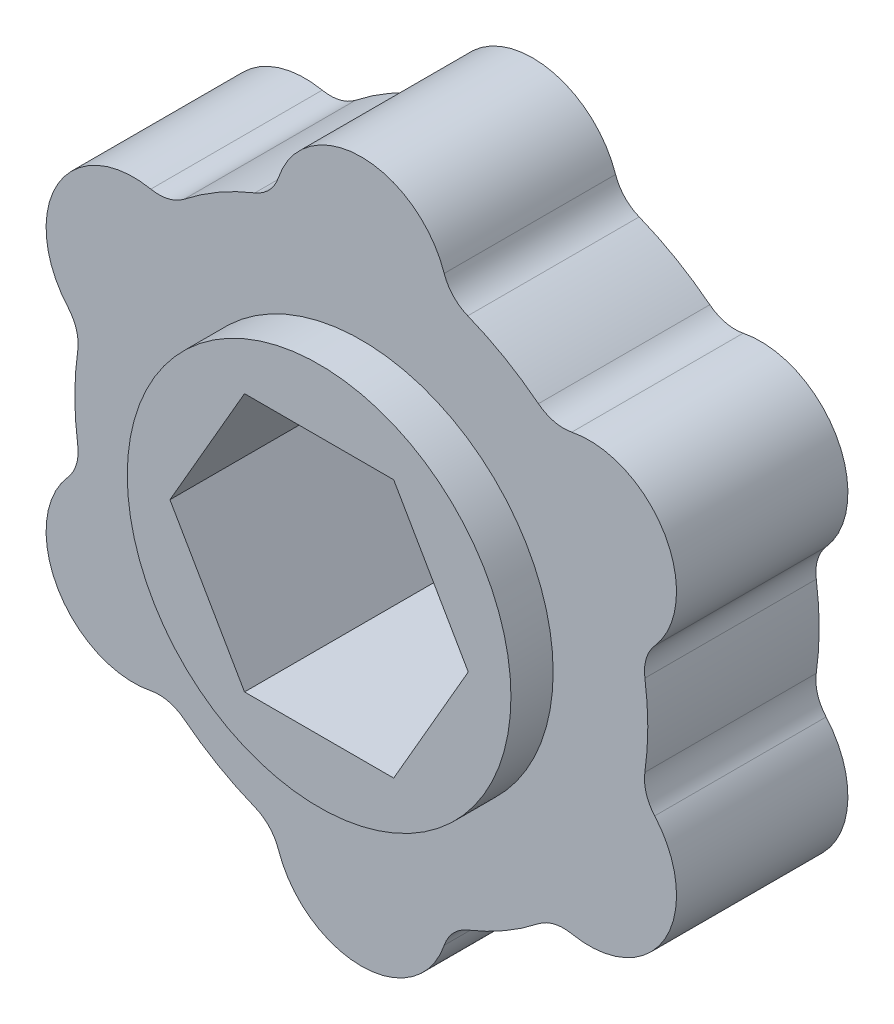
ISO-10303-21;
HEADER;
FILE_DESCRIPTION(('STEP AP214'),'2;1');
FILE_NAME('part.step','',(''),(''),'','','');
FILE_SCHEMA(('AUTOMOTIVE_DESIGN { 1 0 10303 214 1 1 1 1 }'));
ENDSEC;
DATA;
#1=APPLICATION_CONTEXT('core data for automotive mechanical design processes');
#2=APPLICATION_PROTOCOL_DEFINITION('international standard','automotive_design',2000,#1);
#3=PRODUCT_CONTEXT('',#1,'mechanical');
#4=PRODUCT('Part','Part','',(#3));
#5=PRODUCT_RELATED_PRODUCT_CATEGORY('part','',(#4));
#6=PRODUCT_DEFINITION_FORMATION('','',#4);
#7=PRODUCT_DEFINITION_CONTEXT('part definition',#1,'design');
#8=PRODUCT_DEFINITION('design','',#6,#7);
#9=PRODUCT_DEFINITION_SHAPE('','',#8);
#10=(LENGTH_UNIT() NAMED_UNIT(*) SI_UNIT(.MILLI.,.METRE.));
#11=(NAMED_UNIT(*) PLANE_ANGLE_UNIT() SI_UNIT($,.RADIAN.));
#12=(NAMED_UNIT(*) SI_UNIT($,.STERADIAN.) SOLID_ANGLE_UNIT());
#13=UNCERTAINTY_MEASURE_WITH_UNIT(LENGTH_MEASURE(1.E-05),#10,'distance_accuracy_value','');
#14=(GEOMETRIC_REPRESENTATION_CONTEXT(3) GLOBAL_UNCERTAINTY_ASSIGNED_CONTEXT((#13)) GLOBAL_UNIT_ASSIGNED_CONTEXT((#10,
#11,#12)) REPRESENTATION_CONTEXT('',''));
#15=CARTESIAN_POINT('',(0.,0.,0.));
#16=DIRECTION('',(0.,0.,1.));
#17=DIRECTION('',(1.,0.,0.));
#18=AXIS2_PLACEMENT_3D('',#15,#16,#17);
#19=CARTESIAN_POINT('',(0.,0.,8.509));
#20=DIRECTION('',(0.,0.,1.));
#21=DIRECTION('',(1.,0.,0.));
#22=AXIS2_PLACEMENT_3D('',#19,#20,#21);
#23=PLANE('',#22);
#24=CARTESIAN_POINT('',(-11.3064812616481,6.52779999999999,8.509));
#25=DIRECTION('',(0.,0.,1.));
#26=DIRECTION('',(1.,0.,0.));
#27=AXIS2_PLACEMENT_3D('',#24,#25,#26);
#28=CIRCLE('',#27,4.3434);
#29=CARTESIAN_POINT('',(-14.5657181723204,3.65682484857297,8.509));
#30=VERTEX_POINT('',#29);
#31=CARTESIAN_POINT('',(-10.4497623022146,10.7858695373076,8.509));
#32=VERTEX_POINT('',#31);
#33=EDGE_CURVE('E391',#30,#32,#28,.F.);
#34=ORIENTED_EDGE('',*,*,#33,.F.);
#35=CARTESIAN_POINT('',(-16.0905073702957,2.31367857889951,8.509));
#36=DIRECTION('',(0.,0.,1.));
#37=DIRECTION('',(1.,0.,0.));
#38=AXIS2_PLACEMENT_3D('',#35,#36,#37);
#39=CIRCLE('',#38,2.032);
#40=CARTESIAN_POINT('',(-14.0791939490088,2.02446875653707,8.509));
#41=VERTEX_POINT('',#40);
#42=EDGE_CURVE('E110',#30,#41,#39,.F.);
#43=ORIENTED_EDGE('',*,*,#42,.T.);
#44=CARTESIAN_POINT('',(0.,0.,8.509));
#45=DIRECTION('',(0.,0.,1.));
#46=DIRECTION('',(1.,0.,0.));
#47=AXIS2_PLACEMENT_3D('',#44,#45,#46);
#48=CIRCLE('',#47,14.224);
#49=CARTESIAN_POINT('',(-14.0791939490088,-2.02446875653709,8.509));
#50=VERTEX_POINT('',#49);
#51=EDGE_CURVE('E440',#41,#50,#48,.T.);
#52=ORIENTED_EDGE('',*,*,#51,.T.);
#53=CARTESIAN_POINT('',(-16.0905073702957,-2.31367857889953,8.509));
#54=DIRECTION('',(0.,0.,1.));
#55=DIRECTION('',(1.,0.,0.));
#56=AXIS2_PLACEMENT_3D('',#53,#54,#55);
#57=CIRCLE('',#56,2.032);
#58=CARTESIAN_POINT('',(-14.5657181723204,-3.65682484857299,8.509));
#59=VERTEX_POINT('',#58);
#60=EDGE_CURVE('E593',#50,#59,#57,.F.);
#61=ORIENTED_EDGE('',*,*,#60,.T.);
#62=CARTESIAN_POINT('',(-11.3064812616481,-6.52780000000001,8.509));
#63=DIRECTION('',(0.,0.,1.));
#64=DIRECTION('',(1.,0.,0.));
#65=AXIS2_PLACEMENT_3D('',#62,#63,#64);
#66=CIRCLE('',#65,4.3434);
#67=CARTESIAN_POINT('',(-10.4497623022146,-10.7858695373076,8.509));
#68=VERTEX_POINT('',#67);
#69=EDGE_CURVE('E432',#68,#59,#66,.F.);
#70=ORIENTED_EDGE('',*,*,#69,.F.);
#71=CARTESIAN_POINT('',(-10.0489581106667,-12.7779488530071,8.509));
#72=DIRECTION('',(0.,0.,1.));
#73=DIRECTION('',(1.,0.,0.));
#74=AXIS2_PLACEMENT_3D('',#71,#72,#73);
#75=CIRCLE('',#74,2.032);
#76=CARTESIAN_POINT('',(-8.79283834683339,-11.1807052463812,8.509));
#77=VERTEX_POINT('',#76);
#78=EDGE_CURVE('E588',#68,#77,#75,.F.);
#79=ORIENTED_EDGE('',*,*,#78,.T.);
#80=CARTESIAN_POINT('',(-5.28635560217538,-13.2051740029183,8.509));
#81=VERTEX_POINT('',#80);
#82=EDGE_CURVE('E439',#77,#81,#48,.T.);
#83=ORIENTED_EDGE('',*,*,#82,.T.);
#84=CARTESIAN_POINT('',(-6.041549259629,-15.0916274319066,8.509));
#85=DIRECTION('',(0.,0.,1.));
#86=DIRECTION('',(1.,0.,0.));
#87=AXIS2_PLACEMENT_3D('',#84,#85,#86);
#88=CIRCLE('',#87,2.032);
#89=CARTESIAN_POINT('',(-4.11595587010581,-14.4426943858806,8.509));
#90=VERTEX_POINT('',#89);
#91=EDGE_CURVE('E582',#81,#90,#88,.F.);
#92=ORIENTED_EDGE('',*,*,#91,.T.);
#93=CARTESIAN_POINT('',(0.,-13.0556,8.509));
#94=DIRECTION('',(0.,0.,1.));
#95=DIRECTION('',(1.,0.,0.));
#96=AXIS2_PLACEMENT_3D('',#93,#94,#95);
#97=CIRCLE('',#96,4.3434);
#98=CARTESIAN_POINT('',(4.11595587010582,-14.4426943858806,8.509));
#99=VERTEX_POINT('',#98);
#100=EDGE_CURVE('E424',#99,#90,#97,.F.);
#101=ORIENTED_EDGE('',*,*,#100,.F.);
#102=CARTESIAN_POINT('',(6.041549259629,-15.0916274319066,8.509));
#103=DIRECTION('',(0.,0.,1.));
#104=DIRECTION('',(1.,0.,0.));
#105=AXIS2_PLACEMENT_3D('',#102,#103,#104);
#106=CIRCLE('',#105,2.032);
#107=CARTESIAN_POINT('',(5.28635560217538,-13.2051740029183,8.509));
#108=VERTEX_POINT('',#107);
#109=EDGE_CURVE('E576',#99,#108,#106,.F.);
#110=ORIENTED_EDGE('',*,*,#109,.T.);
#111=CARTESIAN_POINT('',(8.7928383468334,-11.1807052463812,8.509));
#112=VERTEX_POINT('',#111);
#113=EDGE_CURVE('E709',#108,#112,#48,.T.);
#114=ORIENTED_EDGE('',*,*,#113,.T.);
#115=CARTESIAN_POINT('',(10.0489581106667,-12.7779488530071,8.509));
#116=DIRECTION('',(0.,0.,1.));
#117=DIRECTION('',(1.,0.,0.));
#118=AXIS2_PLACEMENT_3D('',#115,#116,#117);
#119=CIRCLE('',#118,2.032);
#120=CARTESIAN_POINT('',(10.4497623022146,-10.7858695373076,8.509));
#121=VERTEX_POINT('',#120);
#122=EDGE_CURVE('E570',#112,#121,#119,.F.);
#123=ORIENTED_EDGE('',*,*,#122,.T.);
#124=CARTESIAN_POINT('',(11.3064812616481,-6.5278,8.509));
#125=DIRECTION('',(0.,0.,1.));
#126=DIRECTION('',(1.,0.,0.));
#127=AXIS2_PLACEMENT_3D('',#124,#125,#126);
#128=CIRCLE('',#127,4.3434);
#129=CARTESIAN_POINT('',(14.5657181723204,-3.65682484857298,8.509));
#130=VERTEX_POINT('',#129);
#131=EDGE_CURVE('E416',#130,#121,#128,.F.);
#132=ORIENTED_EDGE('',*,*,#131,.F.);
#133=CARTESIAN_POINT('',(16.0905073702957,-2.31367857889952,8.509));
#134=DIRECTION('',(0.,0.,1.));
#135=DIRECTION('',(1.,0.,0.));
#136=AXIS2_PLACEMENT_3D('',#133,#134,#135);
#137=CIRCLE('',#136,2.032);
#138=CARTESIAN_POINT('',(14.0791939490088,-2.02446875653708,8.509));
#139=VERTEX_POINT('',#138);
#140=EDGE_CURVE('E564',#130,#139,#137,.F.);
#141=ORIENTED_EDGE('',*,*,#140,.T.);
#142=CARTESIAN_POINT('',(14.0791939490088,2.02446875653708,8.509));
#143=VERTEX_POINT('',#142);
#144=EDGE_CURVE('E712',#139,#143,#48,.T.);
#145=ORIENTED_EDGE('',*,*,#144,.T.);
#146=CARTESIAN_POINT('',(16.0905073702957,2.31367857889952,8.509));
#147=DIRECTION('',(0.,0.,1.));
#148=DIRECTION('',(1.,0.,0.));
#149=AXIS2_PLACEMENT_3D('',#146,#147,#148);
#150=CIRCLE('',#149,2.032);
#151=CARTESIAN_POINT('',(14.5657181723204,3.65682484857298,8.509));
#152=VERTEX_POINT('',#151);
#153=EDGE_CURVE('E558',#143,#152,#150,.F.);
#154=ORIENTED_EDGE('',*,*,#153,.T.);
#155=CARTESIAN_POINT('',(11.3064812616481,6.5278,8.509));
#156=DIRECTION('',(0.,0.,1.));
#157=DIRECTION('',(1.,0.,0.));
#158=AXIS2_PLACEMENT_3D('',#155,#156,#157);
#159=CIRCLE('',#158,4.3434);
#160=CARTESIAN_POINT('',(10.4497623022146,10.7858695373076,8.509));
#161=VERTEX_POINT('',#160);
#162=EDGE_CURVE('E408',#161,#152,#159,.F.);
#163=ORIENTED_EDGE('',*,*,#162,.F.);
#164=CARTESIAN_POINT('',(10.0489581106667,12.7779488530071,8.509));
#165=DIRECTION('',(0.,0.,1.));
#166=DIRECTION('',(1.,0.,0.));
#167=AXIS2_PLACEMENT_3D('',#164,#165,#166);
#168=CIRCLE('',#167,2.032);
#169=CARTESIAN_POINT('',(8.79283834683339,11.1807052463812,8.509));
#170=VERTEX_POINT('',#169);
#171=EDGE_CURVE('E552',#161,#170,#168,.F.);
#172=ORIENTED_EDGE('',*,*,#171,.T.);
#173=CARTESIAN_POINT('',(5.28635560217538,13.2051740029183,8.509));
#174=VERTEX_POINT('',#173);
#175=EDGE_CURVE('E717',#170,#174,#48,.T.);
#176=ORIENTED_EDGE('',*,*,#175,.T.);
#177=CARTESIAN_POINT('',(6.041549259629,15.0916274319066,8.509));
#178=DIRECTION('',(0.,0.,1.));
#179=DIRECTION('',(1.,0.,0.));
#180=AXIS2_PLACEMENT_3D('',#177,#178,#179);
#181=CIRCLE('',#180,2.032);
#182=CARTESIAN_POINT('',(4.11595587010582,14.4426943858806,8.509));
#183=VERTEX_POINT('',#182);
#184=EDGE_CURVE('E546',#174,#183,#181,.F.);
#185=ORIENTED_EDGE('',*,*,#184,.T.);
#186=CARTESIAN_POINT('',(0.,13.0556,8.509));
#187=DIRECTION('',(0.,0.,1.));
#188=DIRECTION('',(1.,0.,0.));
#189=AXIS2_PLACEMENT_3D('',#186,#187,#188);
#190=CIRCLE('',#189,4.3434);
#191=CARTESIAN_POINT('',(-4.11595587010582,14.4426943858806,8.509));
#192=VERTEX_POINT('',#191);
#193=EDGE_CURVE('E400',#192,#183,#190,.F.);
#194=ORIENTED_EDGE('',*,*,#193,.F.);
#195=CARTESIAN_POINT('',(-6.041549259629,15.0916274319066,8.509));
#196=DIRECTION('',(0.,0.,1.));
#197=DIRECTION('',(1.,0.,0.));
#198=AXIS2_PLACEMENT_3D('',#195,#196,#197);
#199=CIRCLE('',#198,2.032);
#200=CARTESIAN_POINT('',(-5.28635560217538,13.2051740029183,8.509));
#201=VERTEX_POINT('',#200);
#202=EDGE_CURVE('E540',#192,#201,#199,.F.);
#203=ORIENTED_EDGE('',*,*,#202,.T.);
#204=CARTESIAN_POINT('',(-8.7928383468334,11.1807052463812,8.509));
#205=VERTEX_POINT('',#204);
#206=EDGE_CURVE('E444',#201,#205,#48,.T.);
#207=ORIENTED_EDGE('',*,*,#206,.T.);
#208=CARTESIAN_POINT('',(-10.0489581106667,12.7779488530071,8.509));
#209=DIRECTION('',(0.,0.,1.));
#210=DIRECTION('',(1.,0.,0.));
#211=AXIS2_PLACEMENT_3D('',#208,#209,#210);
#212=CIRCLE('',#211,2.032);
#213=EDGE_CURVE('E534',#205,#32,#212,.F.);
#214=ORIENTED_EDGE('',*,*,#213,.T.);
#215=EDGE_LOOP('',(#34,#43,#52,#61,#70,#79,#83,#92,#101,#110,#114,#123,#132,#141,#145,#154,#163,
#172,#176,#185,#194,#203,#207,#214));
#216=FACE_BOUND('',#215,.T.);
#217=CARTESIAN_POINT('',(0.,0.,8.509));
#218=DIRECTION('',(0.,0.,1.));
#219=DIRECTION('',(1.,0.,0.));
#220=AXIS2_PLACEMENT_3D('',#217,#218,#219);
#221=CIRCLE('',#220,9.525);
#222=CARTESIAN_POINT('',(9.525,0.,8.509));
#223=VERTEX_POINT('',#222);
#224=EDGE_CURVE('E344',#223,#223,#221,.T.);
#225=ORIENTED_EDGE('',*,*,#224,.F.);
#226=EDGE_LOOP('',(#225));
#227=FACE_BOUND('',#226,.T.);
#228=ADVANCED_FACE('F101',(#216,#227),#23,.T.);
#229=CARTESIAN_POINT('',(0.,0.,0.));
#230=DIRECTION('',(0.,0.,1.));
#231=DIRECTION('',(1.,0.,0.));
#232=AXIS2_PLACEMENT_3D('',#229,#230,#231);
#233=PLANE('',#232);
#234=CARTESIAN_POINT('',(0.,0.,0.));
#235=DIRECTION('',(0.,0.,1.));
#236=DIRECTION('',(1.,0.,0.));
#237=AXIS2_PLACEMENT_3D('',#234,#235,#236);
#238=CIRCLE('',#237,14.224);
#239=CARTESIAN_POINT('',(-14.0791939490088,2.02446875653707,0.));
#240=VERTEX_POINT('',#239);
#241=CARTESIAN_POINT('',(-14.0791939490088,-2.02446875653709,0.));
#242=VERTEX_POINT('',#241);
#243=EDGE_CURVE('E313',#240,#242,#238,.T.);
#244=ORIENTED_EDGE('',*,*,#243,.F.);
#245=CARTESIAN_POINT('',(-16.0905073702957,2.31367857889951,0.));
#246=DIRECTION('',(0.,0.,1.));
#247=DIRECTION('',(1.,0.,0.));
#248=AXIS2_PLACEMENT_3D('',#245,#246,#247);
#249=CIRCLE('',#248,2.032);
#250=CARTESIAN_POINT('',(-14.5657181723204,3.65682484857297,0.));
#251=VERTEX_POINT('',#250);
#252=EDGE_CURVE('E125',#240,#251,#249,.T.);
#253=ORIENTED_EDGE('',*,*,#252,.T.);
#254=CARTESIAN_POINT('',(-11.3064812616481,6.52779999999999,0.));
#255=DIRECTION('',(0.,0.,1.));
#256=DIRECTION('',(1.,0.,0.));
#257=AXIS2_PLACEMENT_3D('',#254,#255,#256);
#258=CIRCLE('',#257,4.3434);
#259=CARTESIAN_POINT('',(-10.4497623022146,10.7858695373076,0.));
#260=VERTEX_POINT('',#259);
#261=EDGE_CURVE('E396',#251,#260,#258,.F.);
#262=ORIENTED_EDGE('',*,*,#261,.T.);
#263=CARTESIAN_POINT('',(-10.0489581106667,12.7779488530071,0.));
#264=DIRECTION('',(0.,0.,1.));
#265=DIRECTION('',(1.,0.,0.));
#266=AXIS2_PLACEMENT_3D('',#263,#264,#265);
#267=CIRCLE('',#266,2.032);
#268=CARTESIAN_POINT('',(-8.7928383468334,11.1807052463812,0.));
#269=VERTEX_POINT('',#268);
#270=EDGE_CURVE('E531',#260,#269,#267,.T.);
#271=ORIENTED_EDGE('',*,*,#270,.T.);
#272=CARTESIAN_POINT('',(-5.28635560217538,13.2051740029183,0.));
#273=VERTEX_POINT('',#272);
#274=EDGE_CURVE('E448',#273,#269,#238,.T.);
#275=ORIENTED_EDGE('',*,*,#274,.F.);
#276=CARTESIAN_POINT('',(-6.041549259629,15.0916274319066,0.));
#277=DIRECTION('',(0.,0.,1.));
#278=DIRECTION('',(1.,0.,0.));
#279=AXIS2_PLACEMENT_3D('',#276,#277,#278);
#280=CIRCLE('',#279,2.032);
#281=CARTESIAN_POINT('',(-4.11595587010582,14.4426943858806,0.));
#282=VERTEX_POINT('',#281);
#283=EDGE_CURVE('E537',#273,#282,#280,.T.);
#284=ORIENTED_EDGE('',*,*,#283,.T.);
#285=CARTESIAN_POINT('',(0.,13.0556,0.));
#286=DIRECTION('',(0.,0.,1.));
#287=DIRECTION('',(1.,0.,0.));
#288=AXIS2_PLACEMENT_3D('',#285,#286,#287);
#289=CIRCLE('',#288,4.3434);
#290=CARTESIAN_POINT('',(4.11595587010582,14.4426943858806,0.));
#291=VERTEX_POINT('',#290);
#292=EDGE_CURVE('E404',#282,#291,#289,.F.);
#293=ORIENTED_EDGE('',*,*,#292,.T.);
#294=CARTESIAN_POINT('',(6.041549259629,15.0916274319066,0.));
#295=DIRECTION('',(0.,0.,1.));
#296=DIRECTION('',(1.,0.,0.));
#297=AXIS2_PLACEMENT_3D('',#294,#295,#296);
#298=CIRCLE('',#297,2.032);
#299=CARTESIAN_POINT('',(5.28635560217538,13.2051740029183,0.));
#300=VERTEX_POINT('',#299);
#301=EDGE_CURVE('E543',#291,#300,#298,.T.);
#302=ORIENTED_EDGE('',*,*,#301,.T.);
#303=CARTESIAN_POINT('',(8.79283834683339,11.1807052463812,0.));
#304=VERTEX_POINT('',#303);
#305=EDGE_CURVE('E750',#304,#300,#238,.T.);
#306=ORIENTED_EDGE('',*,*,#305,.F.);
#307=CARTESIAN_POINT('',(10.0489581106667,12.7779488530071,0.));
#308=DIRECTION('',(0.,0.,1.));
#309=DIRECTION('',(1.,0.,0.));
#310=AXIS2_PLACEMENT_3D('',#307,#308,#309);
#311=CIRCLE('',#310,2.032);
#312=CARTESIAN_POINT('',(10.4497623022146,10.7858695373076,0.));
#313=VERTEX_POINT('',#312);
#314=EDGE_CURVE('E549',#304,#313,#311,.T.);
#315=ORIENTED_EDGE('',*,*,#314,.T.);
#316=CARTESIAN_POINT('',(11.3064812616481,6.5278,0.));
#317=DIRECTION('',(0.,0.,1.));
#318=DIRECTION('',(1.,0.,0.));
#319=AXIS2_PLACEMENT_3D('',#316,#317,#318);
#320=CIRCLE('',#319,4.3434);
#321=CARTESIAN_POINT('',(14.5657181723204,3.65682484857298,0.));
#322=VERTEX_POINT('',#321);
#323=EDGE_CURVE('E412',#313,#322,#320,.F.);
#324=ORIENTED_EDGE('',*,*,#323,.T.);
#325=CARTESIAN_POINT('',(16.0905073702957,2.31367857889952,0.));
#326=DIRECTION('',(0.,0.,1.));
#327=DIRECTION('',(1.,0.,0.));
#328=AXIS2_PLACEMENT_3D('',#325,#326,#327);
#329=CIRCLE('',#328,2.032);
#330=CARTESIAN_POINT('',(14.0791939490088,2.02446875653708,0.));
#331=VERTEX_POINT('',#330);
#332=EDGE_CURVE('E555',#322,#331,#329,.T.);
#333=ORIENTED_EDGE('',*,*,#332,.T.);
#334=CARTESIAN_POINT('',(14.0791939490088,-2.02446875653708,0.));
#335=VERTEX_POINT('',#334);
#336=EDGE_CURVE('E744',#335,#331,#238,.T.);
#337=ORIENTED_EDGE('',*,*,#336,.F.);
#338=CARTESIAN_POINT('',(16.0905073702957,-2.31367857889952,0.));
#339=DIRECTION('',(0.,0.,1.));
#340=DIRECTION('',(1.,0.,0.));
#341=AXIS2_PLACEMENT_3D('',#338,#339,#340);
#342=CIRCLE('',#341,2.032);
#343=CARTESIAN_POINT('',(14.5657181723204,-3.65682484857298,0.));
#344=VERTEX_POINT('',#343);
#345=EDGE_CURVE('E561',#335,#344,#342,.T.);
#346=ORIENTED_EDGE('',*,*,#345,.T.);
#347=CARTESIAN_POINT('',(11.3064812616481,-6.5278,0.));
#348=DIRECTION('',(0.,0.,1.));
#349=DIRECTION('',(1.,0.,0.));
#350=AXIS2_PLACEMENT_3D('',#347,#348,#349);
#351=CIRCLE('',#350,4.3434);
#352=CARTESIAN_POINT('',(10.4497623022146,-10.7858695373076,0.));
#353=VERTEX_POINT('',#352);
#354=EDGE_CURVE('E420',#344,#353,#351,.F.);
#355=ORIENTED_EDGE('',*,*,#354,.T.);
#356=CARTESIAN_POINT('',(10.0489581106667,-12.7779488530071,0.));
#357=DIRECTION('',(0.,0.,1.));
#358=DIRECTION('',(1.,0.,0.));
#359=AXIS2_PLACEMENT_3D('',#356,#357,#358);
#360=CIRCLE('',#359,2.032);
#361=CARTESIAN_POINT('',(8.7928383468334,-11.1807052463812,0.));
#362=VERTEX_POINT('',#361);
#363=EDGE_CURVE('E567',#353,#362,#360,.T.);
#364=ORIENTED_EDGE('',*,*,#363,.T.);
#365=CARTESIAN_POINT('',(5.28635560217538,-13.2051740029183,0.));
#366=VERTEX_POINT('',#365);
#367=EDGE_CURVE('E741',#366,#362,#238,.T.);
#368=ORIENTED_EDGE('',*,*,#367,.F.);
#369=CARTESIAN_POINT('',(6.041549259629,-15.0916274319066,0.));
#370=DIRECTION('',(0.,0.,1.));
#371=DIRECTION('',(1.,0.,0.));
#372=AXIS2_PLACEMENT_3D('',#369,#370,#371);
#373=CIRCLE('',#372,2.032);
#374=CARTESIAN_POINT('',(4.11595587010582,-14.4426943858806,0.));
#375=VERTEX_POINT('',#374);
#376=EDGE_CURVE('E573',#366,#375,#373,.T.);
#377=ORIENTED_EDGE('',*,*,#376,.T.);
#378=CARTESIAN_POINT('',(0.,-13.0556,0.));
#379=DIRECTION('',(0.,0.,1.));
#380=DIRECTION('',(1.,0.,0.));
#381=AXIS2_PLACEMENT_3D('',#378,#379,#380);
#382=CIRCLE('',#381,4.3434);
#383=CARTESIAN_POINT('',(-4.11595587010581,-14.4426943858806,0.));
#384=VERTEX_POINT('',#383);
#385=EDGE_CURVE('E428',#375,#384,#382,.F.);
#386=ORIENTED_EDGE('',*,*,#385,.T.);
#387=CARTESIAN_POINT('',(-6.041549259629,-15.0916274319066,0.));
#388=DIRECTION('',(0.,0.,1.));
#389=DIRECTION('',(1.,0.,0.));
#390=AXIS2_PLACEMENT_3D('',#387,#388,#389);
#391=CIRCLE('',#390,2.032);
#392=CARTESIAN_POINT('',(-5.28635560217538,-13.2051740029183,0.));
#393=VERTEX_POINT('',#392);
#394=EDGE_CURVE('E579',#384,#393,#391,.T.);
#395=ORIENTED_EDGE('',*,*,#394,.T.);
#396=CARTESIAN_POINT('',(-8.79283834683339,-11.1807052463812,0.));
#397=VERTEX_POINT('',#396);
#398=EDGE_CURVE('E445',#397,#393,#238,.T.);
#399=ORIENTED_EDGE('',*,*,#398,.F.);
#400=CARTESIAN_POINT('',(-10.0489581106667,-12.7779488530071,0.));
#401=DIRECTION('',(0.,0.,1.));
#402=DIRECTION('',(1.,0.,0.));
#403=AXIS2_PLACEMENT_3D('',#400,#401,#402);
#404=CIRCLE('',#403,2.032);
#405=CARTESIAN_POINT('',(-10.4497623022146,-10.7858695373076,0.));
#406=VERTEX_POINT('',#405);
#407=EDGE_CURVE('E585',#397,#406,#404,.T.);
#408=ORIENTED_EDGE('',*,*,#407,.T.);
#409=CARTESIAN_POINT('',(-11.3064812616481,-6.52780000000001,0.));
#410=DIRECTION('',(0.,0.,1.));
#411=DIRECTION('',(1.,0.,0.));
#412=AXIS2_PLACEMENT_3D('',#409,#410,#411);
#413=CIRCLE('',#412,4.3434);
#414=CARTESIAN_POINT('',(-14.5657181723204,-3.65682484857299,0.));
#415=VERTEX_POINT('',#414);
#416=EDGE_CURVE('E436',#406,#415,#413,.F.);
#417=ORIENTED_EDGE('',*,*,#416,.T.);
#418=CARTESIAN_POINT('',(-16.0905073702957,-2.31367857889953,0.));
#419=DIRECTION('',(0.,0.,1.));
#420=DIRECTION('',(1.,0.,0.));
#421=AXIS2_PLACEMENT_3D('',#418,#419,#420);
#422=CIRCLE('',#421,2.032);
#423=EDGE_CURVE('E117',#415,#242,#422,.T.);
#424=ORIENTED_EDGE('',*,*,#423,.T.);
#425=EDGE_LOOP('',(#244,#253,#262,#271,#275,#284,#293,#302,#306,#315,#324,#333,#337,#346,#355,
#364,#368,#377,#386,#395,#399,#408,#417,#424));
#426=FACE_BOUND('',#425,.T.);
#427=CARTESIAN_POINT('',(0.,0.,0.));
#428=DIRECTION('',(0.,0.,1.));
#429=DIRECTION('',(1.,0.,0.));
#430=AXIS2_PLACEMENT_3D('',#427,#428,#429);
#431=CIRCLE('',#430,9.525);
#432=CARTESIAN_POINT('',(9.525,0.,0.));
#433=VERTEX_POINT('',#432);
#434=EDGE_CURVE('E12',#433,#433,#431,.F.);
#435=ORIENTED_EDGE('',*,*,#434,.F.);
#436=EDGE_LOOP('',(#435));
#437=FACE_BOUND('',#436,.T.);
#438=ADVANCED_FACE('F618',(#426,#437),#233,.F.);
#439=CARTESIAN_POINT('',(-11.3064812616481,6.52779999999999,8.509));
#440=DIRECTION('',(0.,0.,-1.));
#441=DIRECTION('',(-1.,0.,0.));
#442=AXIS2_PLACEMENT_3D('',#439,#440,#441);
#443=CYLINDRICAL_SURFACE('',#442,4.3434);
#444=ORIENTED_EDGE('',*,*,#33,.T.);
#445=DIRECTION('',(0.,0.,-1.));
#446=VECTOR('',#445,1.);
#447=CARTESIAN_POINT('',(-10.4497623022146,10.7858695373076,8.509));
#448=LINE('',#447,#446);
#449=EDGE_CURVE('E451',#32,#260,#448,.T.);
#450=ORIENTED_EDGE('',*,*,#449,.T.);
#451=ORIENTED_EDGE('',*,*,#261,.F.);
#452=DIRECTION('',(0.,0.,-1.));
#453=VECTOR('',#452,1.);
#454=CARTESIAN_POINT('',(-14.5657181723204,3.65682484857297,8.509));
#455=LINE('',#454,#453);
#456=EDGE_CURVE('E395',#251,#30,#455,.F.);
#457=ORIENTED_EDGE('',*,*,#456,.T.);
#458=EDGE_LOOP('',(#444,#450,#451,#457));
#459=FACE_BOUND('',#458,.T.);
#460=ADVANCED_FACE('F623',(#459),#443,.T.);
#461=CARTESIAN_POINT('',(0.,-13.0556,8.509));
#462=DIRECTION('',(0.,0.,-1.));
#463=DIRECTION('',(-1.,0.,0.));
#464=AXIS2_PLACEMENT_3D('',#461,#462,#463);
#465=CYLINDRICAL_SURFACE('',#464,4.3434);
#466=ORIENTED_EDGE('',*,*,#385,.F.);
#467=DIRECTION('',(0.,0.,-1.));
#468=VECTOR('',#467,1.);
#469=CARTESIAN_POINT('',(4.11595587010582,-14.4426943858806,8.509));
#470=LINE('',#469,#468);
#471=EDGE_CURVE('E508',#375,#99,#470,.F.);
#472=ORIENTED_EDGE('',*,*,#471,.T.);
#473=ORIENTED_EDGE('',*,*,#100,.T.);
#474=DIRECTION('',(0.,0.,-1.));
#475=VECTOR('',#474,1.);
#476=CARTESIAN_POINT('',(-4.11595587010581,-14.4426943858806,8.509));
#477=LINE('',#476,#475);
#478=EDGE_CURVE('E504',#90,#384,#477,.T.);
#479=ORIENTED_EDGE('',*,*,#478,.T.);
#480=EDGE_LOOP('',(#466,#472,#473,#479));
#481=FACE_BOUND('',#480,.T.);
#482=ADVANCED_FACE('F629',(#481),#465,.T.);
#483=CARTESIAN_POINT('',(11.3064812616481,-6.5278,8.509));
#484=DIRECTION('',(0.,0.,-1.));
#485=DIRECTION('',(-1.,0.,0.));
#486=AXIS2_PLACEMENT_3D('',#483,#484,#485);
#487=CYLINDRICAL_SURFACE('',#486,4.3434);
#488=ORIENTED_EDGE('',*,*,#354,.F.);
#489=DIRECTION('',(0.,0.,-1.));
#490=VECTOR('',#489,1.);
#491=CARTESIAN_POINT('',(14.5657181723204,-3.65682484857298,8.509));
#492=LINE('',#491,#490);
#493=EDGE_CURVE('E494',#344,#130,#492,.F.);
#494=ORIENTED_EDGE('',*,*,#493,.T.);
#495=ORIENTED_EDGE('',*,*,#131,.T.);
#496=DIRECTION('',(0.,0.,-1.));
#497=VECTOR('',#496,1.);
#498=CARTESIAN_POINT('',(10.4497623022146,-10.7858695373076,8.509));
#499=LINE('',#498,#497);
#500=EDGE_CURVE('E490',#121,#353,#499,.T.);
#501=ORIENTED_EDGE('',*,*,#500,.T.);
#502=EDGE_LOOP('',(#488,#494,#495,#501));
#503=FACE_BOUND('',#502,.T.);
#504=ADVANCED_FACE('F640',(#503),#487,.T.);
#505=CARTESIAN_POINT('',(11.3064812616481,6.5278,8.509));
#506=DIRECTION('',(0.,0.,-1.));
#507=DIRECTION('',(-1.,0.,0.));
#508=AXIS2_PLACEMENT_3D('',#505,#506,#507);
#509=CYLINDRICAL_SURFACE('',#508,4.3434);
#510=ORIENTED_EDGE('',*,*,#323,.F.);
#511=DIRECTION('',(0.,0.,-1.));
#512=VECTOR('',#511,1.);
#513=CARTESIAN_POINT('',(10.4497623022146,10.7858695373076,8.509));
#514=LINE('',#513,#512);
#515=EDGE_CURVE('E480',#313,#161,#514,.F.);
#516=ORIENTED_EDGE('',*,*,#515,.T.);
#517=ORIENTED_EDGE('',*,*,#162,.T.);
#518=DIRECTION('',(0.,0.,-1.));
#519=VECTOR('',#518,1.);
#520=CARTESIAN_POINT('',(14.5657181723204,3.65682484857298,8.509));
#521=LINE('',#520,#519);
#522=EDGE_CURVE('E476',#152,#322,#521,.T.);
#523=ORIENTED_EDGE('',*,*,#522,.T.);
#524=EDGE_LOOP('',(#510,#516,#517,#523));
#525=FACE_BOUND('',#524,.T.);
#526=ADVANCED_FACE('F635',(#525),#509,.T.);
#527=CARTESIAN_POINT('',(0.,13.0556,8.509));
#528=DIRECTION('',(0.,0.,-1.));
#529=DIRECTION('',(-1.,0.,0.));
#530=AXIS2_PLACEMENT_3D('',#527,#528,#529);
#531=CYLINDRICAL_SURFACE('',#530,4.3434);
#532=ORIENTED_EDGE('',*,*,#292,.F.);
#533=DIRECTION('',(0.,0.,-1.));
#534=VECTOR('',#533,1.);
#535=CARTESIAN_POINT('',(-4.11595587010582,14.4426943858806,8.509));
#536=LINE('',#535,#534);
#537=EDGE_CURVE('E466',#282,#192,#536,.F.);
#538=ORIENTED_EDGE('',*,*,#537,.T.);
#539=ORIENTED_EDGE('',*,*,#193,.T.);
#540=DIRECTION('',(0.,0.,-1.));
#541=VECTOR('',#540,1.);
#542=CARTESIAN_POINT('',(4.11595587010582,14.4426943858806,8.509));
#543=LINE('',#542,#541);
#544=EDGE_CURVE('E462',#183,#291,#543,.T.);
#545=ORIENTED_EDGE('',*,*,#544,.T.);
#546=EDGE_LOOP('',(#532,#538,#539,#545));
#547=FACE_BOUND('',#546,.T.);
#548=ADVANCED_FACE('F631',(#547),#531,.T.);
#549=CARTESIAN_POINT('',(-11.3064812616481,-6.52780000000001,8.509));
#550=DIRECTION('',(0.,0.,-1.));
#551=DIRECTION('',(-1.,0.,0.));
#552=AXIS2_PLACEMENT_3D('',#549,#550,#551);
#553=CYLINDRICAL_SURFACE('',#552,4.3434);
#554=ORIENTED_EDGE('',*,*,#416,.F.);
#555=DIRECTION('',(0.,0.,-1.));
#556=VECTOR('',#555,1.);
#557=CARTESIAN_POINT('',(-10.4497623022146,-10.7858695373076,8.509));
#558=LINE('',#557,#556);
#559=EDGE_CURVE('E522',#406,#68,#558,.F.);
#560=ORIENTED_EDGE('',*,*,#559,.T.);
#561=ORIENTED_EDGE('',*,*,#69,.T.);
#562=DIRECTION('',(0.,0.,-1.));
#563=VECTOR('',#562,1.);
#564=CARTESIAN_POINT('',(-14.5657181723204,-3.65682484857299,8.509));
#565=LINE('',#564,#563);
#566=EDGE_CURVE('E518',#59,#415,#565,.T.);
#567=ORIENTED_EDGE('',*,*,#566,.T.);
#568=EDGE_LOOP('',(#554,#560,#561,#567));
#569=FACE_BOUND('',#568,.T.);
#570=ADVANCED_FACE('F634',(#569),#553,.T.);
#571=CARTESIAN_POINT('',(0.,0.,8.509));
#572=DIRECTION('',(0.,0.,-1.));
#573=DIRECTION('',(-1.,0.,0.));
#574=AXIS2_PLACEMENT_3D('',#571,#572,#573);
#575=CYLINDRICAL_SURFACE('',#574,14.224);
#576=ORIENTED_EDGE('',*,*,#398,.T.);
#577=DIRECTION('',(0.,0.,-1.));
#578=VECTOR('',#577,1.);
#579=CARTESIAN_POINT('',(-5.28635560217538,-13.2051740029183,8.509));
#580=LINE('',#579,#578);
#581=EDGE_CURVE('E515',#393,#81,#580,.F.);
#582=ORIENTED_EDGE('',*,*,#581,.T.);
#583=ORIENTED_EDGE('',*,*,#82,.F.);
#584=DIRECTION('',(0.,0.,-1.));
#585=VECTOR('',#584,1.);
#586=CARTESIAN_POINT('',(-8.79283834683339,-11.1807052463812,8.509));
#587=LINE('',#586,#585);
#588=EDGE_CURVE('E511',#77,#397,#587,.T.);
#589=ORIENTED_EDGE('',*,*,#588,.T.);
#590=EDGE_LOOP('',(#576,#582,#583,#589));
#591=FACE_BOUND('',#590,.T.);
#592=ADVANCED_FACE('F653',(#591),#575,.T.);
#593=ORIENTED_EDGE('',*,*,#367,.T.);
#594=DIRECTION('',(0.,0.,-1.));
#595=VECTOR('',#594,1.);
#596=CARTESIAN_POINT('',(8.7928383468334,-11.1807052463812,8.509));
#597=LINE('',#596,#595);
#598=EDGE_CURVE('E501',#362,#112,#597,.F.);
#599=ORIENTED_EDGE('',*,*,#598,.T.);
#600=ORIENTED_EDGE('',*,*,#113,.F.);
#601=DIRECTION('',(0.,0.,-1.));
#602=VECTOR('',#601,1.);
#603=CARTESIAN_POINT('',(5.28635560217538,-13.2051740029183,8.509));
#604=LINE('',#603,#602);
#605=EDGE_CURVE('E497',#108,#366,#604,.T.);
#606=ORIENTED_EDGE('',*,*,#605,.T.);
#607=EDGE_LOOP('',(#593,#599,#600,#606));
#608=FACE_BOUND('',#607,.T.);
#609=ADVANCED_FACE('F650',(#608),#575,.T.);
#610=ORIENTED_EDGE('',*,*,#336,.T.);
#611=DIRECTION('',(0.,0.,-1.));
#612=VECTOR('',#611,1.);
#613=CARTESIAN_POINT('',(14.0791939490088,2.02446875653708,8.509));
#614=LINE('',#613,#612);
#615=EDGE_CURVE('E487',#331,#143,#614,.F.);
#616=ORIENTED_EDGE('',*,*,#615,.T.);
#617=ORIENTED_EDGE('',*,*,#144,.F.);
#618=DIRECTION('',(0.,0.,-1.));
#619=VECTOR('',#618,1.);
#620=CARTESIAN_POINT('',(14.0791939490088,-2.02446875653708,8.509));
#621=LINE('',#620,#619);
#622=EDGE_CURVE('E483',#139,#335,#621,.T.);
#623=ORIENTED_EDGE('',*,*,#622,.T.);
#624=EDGE_LOOP('',(#610,#616,#617,#623));
#625=FACE_BOUND('',#624,.T.);
#626=ADVANCED_FACE('F646',(#625),#575,.T.);
#627=ORIENTED_EDGE('',*,*,#305,.T.);
#628=DIRECTION('',(0.,0.,-1.));
#629=VECTOR('',#628,1.);
#630=CARTESIAN_POINT('',(5.28635560217538,13.2051740029183,8.509));
#631=LINE('',#630,#629);
#632=EDGE_CURVE('E473',#300,#174,#631,.F.);
#633=ORIENTED_EDGE('',*,*,#632,.T.);
#634=ORIENTED_EDGE('',*,*,#175,.F.);
#635=DIRECTION('',(0.,0.,-1.));
#636=VECTOR('',#635,1.);
#637=CARTESIAN_POINT('',(8.79283834683339,11.1807052463812,8.509));
#638=LINE('',#637,#636);
#639=EDGE_CURVE('E469',#170,#304,#638,.T.);
#640=ORIENTED_EDGE('',*,*,#639,.T.);
#641=EDGE_LOOP('',(#627,#633,#634,#640));
#642=FACE_BOUND('',#641,.T.);
#643=ADVANCED_FACE('F642',(#642),#575,.T.);
#644=ORIENTED_EDGE('',*,*,#274,.T.);
#645=DIRECTION('',(0.,0.,-1.));
#646=VECTOR('',#645,1.);
#647=CARTESIAN_POINT('',(-8.7928383468334,11.1807052463812,8.509));
#648=LINE('',#647,#646);
#649=EDGE_CURVE('E459',#269,#205,#648,.F.);
#650=ORIENTED_EDGE('',*,*,#649,.T.);
#651=ORIENTED_EDGE('',*,*,#206,.F.);
#652=DIRECTION('',(0.,0.,-1.));
#653=VECTOR('',#652,1.);
#654=CARTESIAN_POINT('',(-5.28635560217538,13.2051740029183,8.509));
#655=LINE('',#654,#653);
#656=EDGE_CURVE('E455',#201,#273,#655,.T.);
#657=ORIENTED_EDGE('',*,*,#656,.T.);
#658=EDGE_LOOP('',(#644,#650,#651,#657));
#659=FACE_BOUND('',#658,.T.);
#660=ADVANCED_FACE('F637',(#659),#575,.T.);
#661=ORIENTED_EDGE('',*,*,#243,.T.);
#662=DIRECTION('',(0.,0.,-1.));
#663=VECTOR('',#662,1.);
#664=CARTESIAN_POINT('',(-14.0791939490088,-2.02446875653709,8.509));
#665=LINE('',#664,#663);
#666=EDGE_CURVE('E528',#242,#50,#665,.F.);
#667=ORIENTED_EDGE('',*,*,#666,.T.);
#668=ORIENTED_EDGE('',*,*,#51,.F.);
#669=DIRECTION('',(0.,0.,-1.));
#670=VECTOR('',#669,1.);
#671=CARTESIAN_POINT('',(-14.0791939490088,2.02446875653707,8.509));
#672=LINE('',#671,#670);
#673=EDGE_CURVE('E525',#41,#240,#672,.T.);
#674=ORIENTED_EDGE('',*,*,#673,.T.);
#675=EDGE_LOOP('',(#661,#667,#668,#674));
#676=FACE_BOUND('',#675,.T.);
#677=ADVANCED_FACE('F605',(#676),#575,.T.);
#678=CARTESIAN_POINT('',(-10.0489581106667,12.7779488530071,8.509));
#679=DIRECTION('',(0.,0.,1.));
#680=DIRECTION('',(1.,0.,0.));
#681=AXIS2_PLACEMENT_3D('',#678,#679,#680);
#682=CYLINDRICAL_SURFACE('',#681,2.032);
#683=ORIENTED_EDGE('',*,*,#213,.F.);
#684=ORIENTED_EDGE('',*,*,#649,.F.);
#685=ORIENTED_EDGE('',*,*,#270,.F.);
#686=ORIENTED_EDGE('',*,*,#449,.F.);
#687=EDGE_LOOP('',(#683,#684,#685,#686));
#688=FACE_BOUND('',#687,.T.);
#689=ADVANCED_FACE('F658',(#688),#682,.F.);
#690=CARTESIAN_POINT('',(-6.041549259629,15.0916274319066,8.509));
#691=DIRECTION('',(0.,0.,1.));
#692=DIRECTION('',(1.,0.,0.));
#693=AXIS2_PLACEMENT_3D('',#690,#691,#692);
#694=CYLINDRICAL_SURFACE('',#693,2.032);
#695=ORIENTED_EDGE('',*,*,#202,.F.);
#696=ORIENTED_EDGE('',*,*,#537,.F.);
#697=ORIENTED_EDGE('',*,*,#283,.F.);
#698=ORIENTED_EDGE('',*,*,#656,.F.);
#699=EDGE_LOOP('',(#695,#696,#697,#698));
#700=FACE_BOUND('',#699,.T.);
#701=ADVANCED_FACE('F661',(#700),#694,.F.);
#702=CARTESIAN_POINT('',(6.041549259629,15.0916274319066,8.509));
#703=DIRECTION('',(0.,0.,1.));
#704=DIRECTION('',(1.,0.,0.));
#705=AXIS2_PLACEMENT_3D('',#702,#703,#704);
#706=CYLINDRICAL_SURFACE('',#705,2.032);
#707=ORIENTED_EDGE('',*,*,#184,.F.);
#708=ORIENTED_EDGE('',*,*,#632,.F.);
#709=ORIENTED_EDGE('',*,*,#301,.F.);
#710=ORIENTED_EDGE('',*,*,#544,.F.);
#711=EDGE_LOOP('',(#707,#708,#709,#710));
#712=FACE_BOUND('',#711,.T.);
#713=ADVANCED_FACE('F665',(#712),#706,.F.);
#714=CARTESIAN_POINT('',(10.0489581106667,12.7779488530071,8.509));
#715=DIRECTION('',(0.,0.,1.));
#716=DIRECTION('',(1.,0.,0.));
#717=AXIS2_PLACEMENT_3D('',#714,#715,#716);
#718=CYLINDRICAL_SURFACE('',#717,2.032);
#719=ORIENTED_EDGE('',*,*,#171,.F.);
#720=ORIENTED_EDGE('',*,*,#515,.F.);
#721=ORIENTED_EDGE('',*,*,#314,.F.);
#722=ORIENTED_EDGE('',*,*,#639,.F.);
#723=EDGE_LOOP('',(#719,#720,#721,#722));
#724=FACE_BOUND('',#723,.T.);
#725=ADVANCED_FACE('F669',(#724),#718,.F.);
#726=CARTESIAN_POINT('',(16.0905073702957,2.31367857889952,8.509));
#727=DIRECTION('',(0.,0.,1.));
#728=DIRECTION('',(1.,0.,0.));
#729=AXIS2_PLACEMENT_3D('',#726,#727,#728);
#730=CYLINDRICAL_SURFACE('',#729,2.032);
#731=ORIENTED_EDGE('',*,*,#153,.F.);
#732=ORIENTED_EDGE('',*,*,#615,.F.);
#733=ORIENTED_EDGE('',*,*,#332,.F.);
#734=ORIENTED_EDGE('',*,*,#522,.F.);
#735=EDGE_LOOP('',(#731,#732,#733,#734));
#736=FACE_BOUND('',#735,.T.);
#737=ADVANCED_FACE('F673',(#736),#730,.F.);
#738=CARTESIAN_POINT('',(16.0905073702957,-2.31367857889952,8.509));
#739=DIRECTION('',(0.,0.,1.));
#740=DIRECTION('',(1.,0.,0.));
#741=AXIS2_PLACEMENT_3D('',#738,#739,#740);
#742=CYLINDRICAL_SURFACE('',#741,2.032);
#743=ORIENTED_EDGE('',*,*,#140,.F.);
#744=ORIENTED_EDGE('',*,*,#493,.F.);
#745=ORIENTED_EDGE('',*,*,#345,.F.);
#746=ORIENTED_EDGE('',*,*,#622,.F.);
#747=EDGE_LOOP('',(#743,#744,#745,#746));
#748=FACE_BOUND('',#747,.T.);
#749=ADVANCED_FACE('F677',(#748),#742,.F.);
#750=CARTESIAN_POINT('',(10.0489581106667,-12.7779488530071,8.509));
#751=DIRECTION('',(0.,0.,1.));
#752=DIRECTION('',(1.,0.,0.));
#753=AXIS2_PLACEMENT_3D('',#750,#751,#752);
#754=CYLINDRICAL_SURFACE('',#753,2.032);
#755=ORIENTED_EDGE('',*,*,#122,.F.);
#756=ORIENTED_EDGE('',*,*,#598,.F.);
#757=ORIENTED_EDGE('',*,*,#363,.F.);
#758=ORIENTED_EDGE('',*,*,#500,.F.);
#759=EDGE_LOOP('',(#755,#756,#757,#758));
#760=FACE_BOUND('',#759,.T.);
#761=ADVANCED_FACE('F681',(#760),#754,.F.);
#762=CARTESIAN_POINT('',(6.041549259629,-15.0916274319066,8.509));
#763=DIRECTION('',(0.,0.,1.));
#764=DIRECTION('',(1.,0.,0.));
#765=AXIS2_PLACEMENT_3D('',#762,#763,#764);
#766=CYLINDRICAL_SURFACE('',#765,2.032);
#767=ORIENTED_EDGE('',*,*,#109,.F.);
#768=ORIENTED_EDGE('',*,*,#471,.F.);
#769=ORIENTED_EDGE('',*,*,#376,.F.);
#770=ORIENTED_EDGE('',*,*,#605,.F.);
#771=EDGE_LOOP('',(#767,#768,#769,#770));
#772=FACE_BOUND('',#771,.T.);
#773=ADVANCED_FACE('F685',(#772),#766,.F.);
#774=CARTESIAN_POINT('',(-6.041549259629,-15.0916274319066,8.509));
#775=DIRECTION('',(0.,0.,1.));
#776=DIRECTION('',(1.,0.,0.));
#777=AXIS2_PLACEMENT_3D('',#774,#775,#776);
#778=CYLINDRICAL_SURFACE('',#777,2.032);
#779=ORIENTED_EDGE('',*,*,#91,.F.);
#780=ORIENTED_EDGE('',*,*,#581,.F.);
#781=ORIENTED_EDGE('',*,*,#394,.F.);
#782=ORIENTED_EDGE('',*,*,#478,.F.);
#783=EDGE_LOOP('',(#779,#780,#781,#782));
#784=FACE_BOUND('',#783,.T.);
#785=ADVANCED_FACE('F689',(#784),#778,.F.);
#786=CARTESIAN_POINT('',(-10.0489581106667,-12.7779488530071,8.509));
#787=DIRECTION('',(0.,0.,1.));
#788=DIRECTION('',(1.,0.,0.));
#789=AXIS2_PLACEMENT_3D('',#786,#787,#788);
#790=CYLINDRICAL_SURFACE('',#789,2.032);
#791=ORIENTED_EDGE('',*,*,#78,.F.);
#792=ORIENTED_EDGE('',*,*,#559,.F.);
#793=ORIENTED_EDGE('',*,*,#407,.F.);
#794=ORIENTED_EDGE('',*,*,#588,.F.);
#795=EDGE_LOOP('',(#791,#792,#793,#794));
#796=FACE_BOUND('',#795,.T.);
#797=ADVANCED_FACE('F615',(#796),#790,.F.);
#798=CARTESIAN_POINT('',(-16.0905073702957,-2.31367857889953,8.509));
#799=DIRECTION('',(0.,0.,1.));
#800=DIRECTION('',(1.,0.,0.));
#801=AXIS2_PLACEMENT_3D('',#798,#799,#800);
#802=CYLINDRICAL_SURFACE('',#801,2.032);
#803=ORIENTED_EDGE('',*,*,#60,.F.);
#804=ORIENTED_EDGE('',*,*,#666,.F.);
#805=ORIENTED_EDGE('',*,*,#423,.F.);
#806=ORIENTED_EDGE('',*,*,#566,.F.);
#807=EDGE_LOOP('',(#803,#804,#805,#806));
#808=FACE_BOUND('',#807,.T.);
#809=ADVANCED_FACE('F608',(#808),#802,.F.);
#810=CARTESIAN_POINT('',(-16.0905073702957,2.31367857889951,8.509));
#811=DIRECTION('',(0.,0.,1.));
#812=DIRECTION('',(1.,0.,0.));
#813=AXIS2_PLACEMENT_3D('',#810,#811,#812);
#814=CYLINDRICAL_SURFACE('',#813,2.032);
#815=ORIENTED_EDGE('',*,*,#42,.F.);
#816=ORIENTED_EDGE('',*,*,#456,.F.);
#817=ORIENTED_EDGE('',*,*,#252,.F.);
#818=ORIENTED_EDGE('',*,*,#673,.F.);
#819=EDGE_LOOP('',(#815,#816,#817,#818));
#820=FACE_BOUND('',#819,.T.);
#821=ADVANCED_FACE('F103',(#820),#814,.F.);
#822=CARTESIAN_POINT('',(3.70283595144767,-6.4135,0.));
#823=DIRECTION('',(0.866025403784439,-0.499999999999999,0.));
#824=DIRECTION('',(0.499999999999999,0.866025403784439,0.));
#825=AXIS2_PLACEMENT_3D('',#822,#823,#824);
#826=PLANE('',#825);
#827=DIRECTION('',(0.,0.,1.));
#828=VECTOR('',#827,1.);
#829=CARTESIAN_POINT('',(3.70283595144767,-6.4135,0.));
#830=LINE('',#829,#828);
#831=CARTESIAN_POINT('',(3.70283595144767,-6.4135,-1.0795));
#832=VERTEX_POINT('',#831);
#833=CARTESIAN_POINT('',(3.70283595144767,-6.4135,10.6045));
#834=VERTEX_POINT('',#833);
#835=EDGE_CURVE('E301',#832,#834,#830,.T.);
#836=ORIENTED_EDGE('',*,*,#835,.T.);
#837=DIRECTION('',(0.499999999999999,0.866025403784439,0.));
#838=VECTOR('',#837,1.);
#839=CARTESIAN_POINT('',(3.70283595144767,-6.4135,10.6045));
#840=LINE('',#839,#838);
#841=CARTESIAN_POINT('',(7.40567190289533,0.,10.6045));
#842=VERTEX_POINT('',#841);
#843=EDGE_CURVE('E305',#834,#842,#840,.T.);
#844=ORIENTED_EDGE('',*,*,#843,.T.);
#845=DIRECTION('',(0.,0.,1.));
#846=VECTOR('',#845,1.);
#847=CARTESIAN_POINT('',(7.40567190289533,0.,0.));
#848=LINE('',#847,#846);
#849=CARTESIAN_POINT('',(7.40567190289533,0.,-1.0795));
#850=VERTEX_POINT('',#849);
#851=EDGE_CURVE('E376',#850,#842,#848,.T.);
#852=ORIENTED_EDGE('',*,*,#851,.F.);
#853=DIRECTION('',(-0.499999999999999,-0.866025403784439,0.));
#854=VECTOR('',#853,1.);
#855=CARTESIAN_POINT('',(3.70283595144767,-6.4135,-1.0795));
#856=LINE('',#855,#854);
#857=EDGE_CURVE('E308',#850,#832,#856,.T.);
#858=ORIENTED_EDGE('',*,*,#857,.T.);
#859=EDGE_LOOP('',(#836,#844,#852,#858));
#860=FACE_BOUND('',#859,.T.);
#861=ADVANCED_FACE('F303',(#860),#826,.F.);
#862=CARTESIAN_POINT('',(-3.70283595144766,-6.4135,0.));
#863=DIRECTION('',(0.,-1.,0.));
#864=DIRECTION('',(1.,0.,0.));
#865=AXIS2_PLACEMENT_3D('',#862,#863,#864);
#866=PLANE('',#865);
#867=DIRECTION('',(0.,0.,1.));
#868=VECTOR('',#867,1.);
#869=CARTESIAN_POINT('',(-3.70283595144766,-6.4135,0.));
#870=LINE('',#869,#868);
#871=CARTESIAN_POINT('',(-3.70283595144766,-6.4135,-1.0795));
#872=VERTEX_POINT('',#871);
#873=CARTESIAN_POINT('',(-3.70283595144759,-6.41350000000005,10.6045));
#874=VERTEX_POINT('',#873);
#875=EDGE_CURVE('E314',#872,#874,#870,.T.);
#876=ORIENTED_EDGE('',*,*,#875,.T.);
#877=DIRECTION('',(1.,0.,0.));
#878=VECTOR('',#877,1.);
#879=CARTESIAN_POINT('',(-3.70283595144759,-6.41350000000005,10.6045));
#880=LINE('',#879,#878);
#881=EDGE_CURVE('E317',#874,#834,#880,.T.);
#882=ORIENTED_EDGE('',*,*,#881,.T.);
#883=ORIENTED_EDGE('',*,*,#835,.F.);
#884=DIRECTION('',(-1.,0.,0.));
#885=VECTOR('',#884,1.);
#886=CARTESIAN_POINT('',(-3.70283595144766,-6.4135,-1.0795));
#887=LINE('',#886,#885);
#888=EDGE_CURVE('E354',#832,#872,#887,.T.);
#889=ORIENTED_EDGE('',*,*,#888,.T.);
#890=EDGE_LOOP('',(#876,#882,#883,#889));
#891=FACE_BOUND('',#890,.T.);
#892=ADVANCED_FACE('F318',(#891),#866,.F.);
#893=CARTESIAN_POINT('',(-7.40567190289533,0.,0.));
#894=DIRECTION('',(-0.866025403784439,-0.5,0.));
#895=DIRECTION('',(0.5,-0.866025403784439,0.));
#896=AXIS2_PLACEMENT_3D('',#893,#894,#895);
#897=PLANE('',#896);
#898=DIRECTION('',(0.,0.,1.));
#899=VECTOR('',#898,1.);
#900=CARTESIAN_POINT('',(-7.40567190289533,0.,0.));
#901=LINE('',#900,#899);
#902=CARTESIAN_POINT('',(-7.40567190289533,0.,-1.0795));
#903=VERTEX_POINT('',#902);
#904=CARTESIAN_POINT('',(-7.40567190289533,0.,10.6045));
#905=VERTEX_POINT('',#904);
#906=EDGE_CURVE('E380',#903,#905,#901,.T.);
#907=ORIENTED_EDGE('',*,*,#906,.T.);
#908=DIRECTION('',(0.500000000000009,-0.866025403784433,0.));
#909=VECTOR('',#908,1.);
#910=CARTESIAN_POINT('',(-7.40567190289533,0.,10.6045));
#911=LINE('',#910,#909);
#912=EDGE_CURVE('E341',#905,#874,#911,.T.);
#913=ORIENTED_EDGE('',*,*,#912,.T.);
#914=ORIENTED_EDGE('',*,*,#875,.F.);
#915=DIRECTION('',(-0.5,0.866025403784438,0.));
#916=VECTOR('',#915,1.);
#917=CARTESIAN_POINT('',(-7.40567190289533,0.,-1.0795));
#918=LINE('',#917,#916);
#919=EDGE_CURVE('E357',#872,#903,#918,.T.);
#920=ORIENTED_EDGE('',*,*,#919,.T.);
#921=EDGE_LOOP('',(#907,#913,#914,#920));
#922=FACE_BOUND('',#921,.T.);
#923=ADVANCED_FACE('F913',(#922),#897,.F.);
#924=CARTESIAN_POINT('',(-3.70283595144767,6.4135,0.));
#925=DIRECTION('',(-0.866025403784439,0.5,0.));
#926=DIRECTION('',(-0.5,-0.866025403784439,0.));
#927=AXIS2_PLACEMENT_3D('',#924,#925,#926);
#928=PLANE('',#927);
#929=DIRECTION('',(0.,0.,1.));
#930=VECTOR('',#929,1.);
#931=CARTESIAN_POINT('',(-3.70283595144767,6.4135,0.));
#932=LINE('',#931,#930);
#933=CARTESIAN_POINT('',(-3.70283595144767,6.4135,-1.0795));
#934=VERTEX_POINT('',#933);
#935=CARTESIAN_POINT('',(-3.70283595144771,6.41349999999997,10.6045));
#936=VERTEX_POINT('',#935);
#937=EDGE_CURVE('E383',#934,#936,#932,.T.);
#938=ORIENTED_EDGE('',*,*,#937,.T.);
#939=DIRECTION('',(-0.499999999999993,-0.866025403784443,0.));
#940=VECTOR('',#939,1.);
#941=CARTESIAN_POINT('',(-3.70283595144771,6.41349999999997,10.6045));
#942=LINE('',#941,#940);
#943=EDGE_CURVE('E337',#936,#905,#942,.T.);
#944=ORIENTED_EDGE('',*,*,#943,.T.);
#945=ORIENTED_EDGE('',*,*,#906,.F.);
#946=DIRECTION('',(0.5,0.866025403784439,0.));
#947=VECTOR('',#946,1.);
#948=CARTESIAN_POINT('',(-3.70283595144767,6.4135,-1.0795));
#949=LINE('',#948,#947);
#950=EDGE_CURVE('E361',#903,#934,#949,.T.);
#951=ORIENTED_EDGE('',*,*,#950,.T.);
#952=EDGE_LOOP('',(#938,#944,#945,#951));
#953=FACE_BOUND('',#952,.T.);
#954=ADVANCED_FACE('F922',(#953),#928,.F.);
#955=CARTESIAN_POINT('',(3.70283595144767,6.4135,0.));
#956=DIRECTION('',(0.,1.,0.));
#957=DIRECTION('',(-1.,0.,0.));
#958=AXIS2_PLACEMENT_3D('',#955,#956,#957);
#959=PLANE('',#958);
#960=DIRECTION('',(0.,0.,1.));
#961=VECTOR('',#960,1.);
#962=CARTESIAN_POINT('',(3.70283595144767,6.4135,0.));
#963=LINE('',#962,#961);
#964=CARTESIAN_POINT('',(3.70283595144767,6.4135,-1.0795));
#965=VERTEX_POINT('',#964);
#966=CARTESIAN_POINT('',(3.70283595144763,6.41350000000002,10.6045));
#967=VERTEX_POINT('',#966);
#968=EDGE_CURVE('E386',#965,#967,#963,.T.);
#969=ORIENTED_EDGE('',*,*,#968,.T.);
#970=DIRECTION('',(-1.,0.,0.));
#971=VECTOR('',#970,1.);
#972=CARTESIAN_POINT('',(3.70283595144763,6.41350000000002,10.6045));
#973=LINE('',#972,#971);
#974=EDGE_CURVE('E331',#967,#936,#973,.T.);
#975=ORIENTED_EDGE('',*,*,#974,.T.);
#976=ORIENTED_EDGE('',*,*,#937,.F.);
#977=DIRECTION('',(1.,0.,0.));
#978=VECTOR('',#977,1.);
#979=CARTESIAN_POINT('',(3.70283595144767,6.4135,-1.0795));
#980=LINE('',#979,#978);
#981=EDGE_CURVE('E365',#934,#965,#980,.T.);
#982=ORIENTED_EDGE('',*,*,#981,.T.);
#983=EDGE_LOOP('',(#969,#975,#976,#982));
#984=FACE_BOUND('',#983,.T.);
#985=ADVANCED_FACE('F932',(#984),#959,.F.);
#986=CARTESIAN_POINT('',(7.40567190289533,0.,0.));
#987=DIRECTION('',(0.866025403784439,0.5,0.));
#988=DIRECTION('',(-0.5,0.866025403784439,0.));
#989=AXIS2_PLACEMENT_3D('',#986,#987,#988);
#990=PLANE('',#989);
#991=ORIENTED_EDGE('',*,*,#851,.T.);
#992=DIRECTION('',(-0.500000000000003,0.866025403784437,0.));
#993=VECTOR('',#992,1.);
#994=CARTESIAN_POINT('',(7.40567190289533,0.,10.6045));
#995=LINE('',#994,#993);
#996=EDGE_CURVE('E327',#842,#967,#995,.T.);
#997=ORIENTED_EDGE('',*,*,#996,.T.);
#998=ORIENTED_EDGE('',*,*,#968,.F.);
#999=DIRECTION('',(0.5,-0.866025403784439,0.));
#1000=VECTOR('',#999,1.);
#1001=CARTESIAN_POINT('',(7.40567190289533,0.,-1.0795));
#1002=LINE('',#1001,#1000);
#1003=EDGE_CURVE('E369',#965,#850,#1002,.T.);
#1004=ORIENTED_EDGE('',*,*,#1003,.T.);
#1005=EDGE_LOOP('',(#991,#997,#998,#1004));
#1006=FACE_BOUND('',#1005,.T.);
#1007=ADVANCED_FACE('F942',(#1006),#990,.F.);
#1008=CARTESIAN_POINT('',(0.,0.,-1.0795));
#1009=DIRECTION('',(0.,0.,-1.));
#1010=DIRECTION('',(-1.,0.,0.));
#1011=AXIS2_PLACEMENT_3D('',#1008,#1009,#1010);
#1012=PLANE('',#1011);
#1013=CARTESIAN_POINT('',(0.,0.,-1.0795));
#1014=DIRECTION('',(0.,0.,-1.));
#1015=DIRECTION('',(-1.,0.,0.));
#1016=AXIS2_PLACEMENT_3D('',#1013,#1014,#1015);
#1017=CIRCLE('',#1016,9.525);
#1018=CARTESIAN_POINT('',(-9.525,0.,-1.0795));
#1019=VERTEX_POINT('',#1018);
#1020=EDGE_CURVE('E373',#1019,#1019,#1017,.T.);
#1021=ORIENTED_EDGE('',*,*,#1020,.T.);
#1022=EDGE_LOOP('',(#1021));
#1023=FACE_BOUND('',#1022,.T.);
#1024=ORIENTED_EDGE('',*,*,#888,.F.);
#1025=ORIENTED_EDGE('',*,*,#857,.F.);
#1026=ORIENTED_EDGE('',*,*,#1003,.F.);
#1027=ORIENTED_EDGE('',*,*,#981,.F.);
#1028=ORIENTED_EDGE('',*,*,#950,.F.);
#1029=ORIENTED_EDGE('',*,*,#919,.F.);
#1030=EDGE_LOOP('',(#1024,#1025,#1026,#1027,#1028,#1029));
#1031=FACE_BOUND('',#1030,.T.);
#1032=ADVANCED_FACE('F952',(#1023,#1031),#1012,.T.);
#1033=CARTESIAN_POINT('',(0.,0.,-1.0795));
#1034=DIRECTION('',(0.,0.,1.));
#1035=DIRECTION('',(1.,0.,0.));
#1036=AXIS2_PLACEMENT_3D('',#1033,#1034,#1035);
#1037=CYLINDRICAL_SURFACE('',#1036,9.525);
#1038=ORIENTED_EDGE('',*,*,#1020,.F.);
#1039=EDGE_LOOP('',(#1038));
#1040=FACE_BOUND('',#1039,.T.);
#1041=ORIENTED_EDGE('',*,*,#434,.T.);
#1042=EDGE_LOOP('',(#1041));
#1043=FACE_BOUND('',#1042,.T.);
#1044=ADVANCED_FACE('F969',(#1040,#1043),#1037,.T.);
#1045=CARTESIAN_POINT('',(0.,0.,10.6045));
#1046=DIRECTION('',(0.,0.,1.));
#1047=DIRECTION('',(1.,0.,0.));
#1048=AXIS2_PLACEMENT_3D('',#1045,#1046,#1047);
#1049=PLANE('',#1048);
#1050=CARTESIAN_POINT('',(0.,0.,10.6045));
#1051=DIRECTION('',(0.,0.,1.));
#1052=DIRECTION('',(1.,0.,0.));
#1053=AXIS2_PLACEMENT_3D('',#1050,#1051,#1052);
#1054=CIRCLE('',#1053,9.525);
#1055=CARTESIAN_POINT('',(9.525,0.,10.6045));
#1056=VERTEX_POINT('',#1055);
#1057=EDGE_CURVE('E345',#1056,#1056,#1054,.T.);
#1058=ORIENTED_EDGE('',*,*,#1057,.T.);
#1059=EDGE_LOOP('',(#1058));
#1060=FACE_BOUND('',#1059,.T.);
#1061=ORIENTED_EDGE('',*,*,#843,.F.);
#1062=ORIENTED_EDGE('',*,*,#881,.F.);
#1063=ORIENTED_EDGE('',*,*,#912,.F.);
#1064=ORIENTED_EDGE('',*,*,#943,.F.);
#1065=ORIENTED_EDGE('',*,*,#974,.F.);
#1066=ORIENTED_EDGE('',*,*,#996,.F.);
#1067=EDGE_LOOP('',(#1061,#1062,#1063,#1064,#1065,#1066));
#1068=FACE_BOUND('',#1067,.T.);
#1069=ADVANCED_FACE('F324',(#1060,#1068),#1049,.T.);
#1070=CARTESIAN_POINT('',(0.,0.,10.6045));
#1071=DIRECTION('',(0.,0.,-1.));
#1072=DIRECTION('',(-1.,0.,0.));
#1073=AXIS2_PLACEMENT_3D('',#1070,#1071,#1072);
#1074=CYLINDRICAL_SURFACE('',#1073,9.525);
#1075=ORIENTED_EDGE('',*,*,#1057,.F.);
#1076=EDGE_LOOP('',(#1075));
#1077=FACE_BOUND('',#1076,.T.);
#1078=ORIENTED_EDGE('',*,*,#224,.T.);
#1079=EDGE_LOOP('',(#1078));
#1080=FACE_BOUND('',#1079,.T.);
#1081=ADVANCED_FACE('F992',(#1077,#1080),#1074,.T.);
#1082=CLOSED_SHELL('',(#228,#438,#460,#482,#504,#526,#548,#570,#592,#609,#626,#643,#660,#677,
#689,#701,#713,#725,#737,#749,#761,#773,#785,#797,#809,#821,#861,#892,#923,#954,#985,#1007,
#1032,#1044,#1069,#1081));
#1083=MANIFOLD_SOLID_BREP('B2',#1082);
#1084=ADVANCED_BREP_SHAPE_REPRESENTATION('',(#18,#1083),#14);
#1085=SHAPE_DEFINITION_REPRESENTATION(#9,#1084);
ENDSEC;
END-ISO-10303-21;
